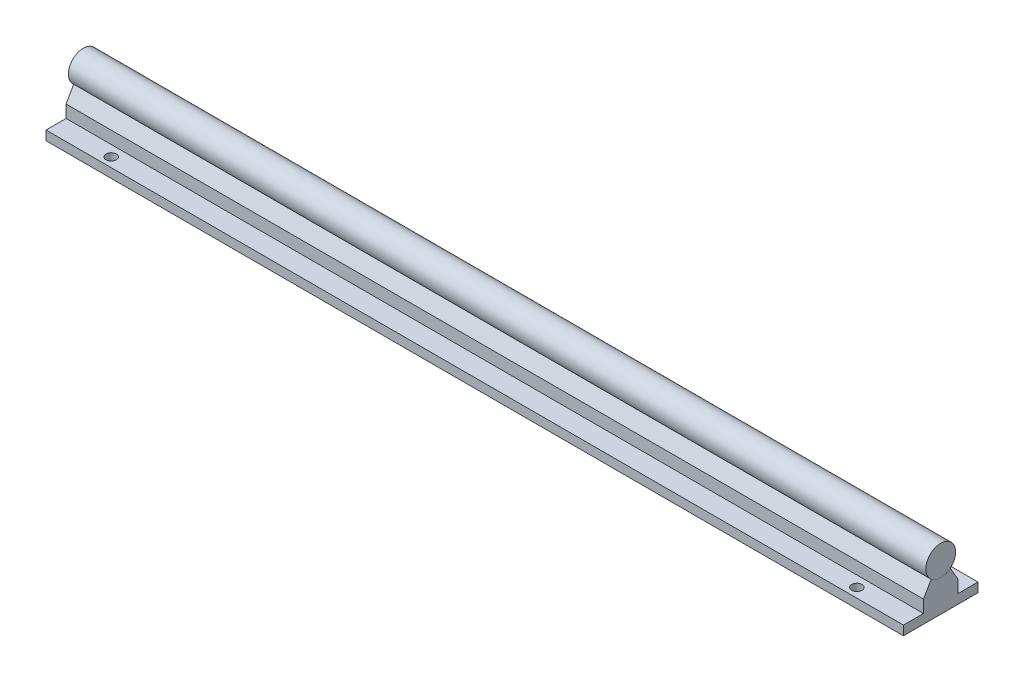
ISO-10303-21;
HEADER;
FILE_DESCRIPTION(('STEP AP214'),'2;1');
FILE_NAME('part.step','',(''),(''),'','','');
FILE_SCHEMA(('AUTOMOTIVE_DESIGN { 1 0 10303 214 1 1 1 1 }'));
ENDSEC;
DATA;
#1=APPLICATION_CONTEXT('core data for automotive mechanical design processes');
#2=APPLICATION_PROTOCOL_DEFINITION('international standard','automotive_design',2000,#1);
#3=PRODUCT_CONTEXT('',#1,'mechanical');
#4=PRODUCT('Part','Part','',(#3));
#5=PRODUCT_RELATED_PRODUCT_CATEGORY('part','',(#4));
#6=PRODUCT_DEFINITION_FORMATION('','',#4);
#7=PRODUCT_DEFINITION_CONTEXT('part definition',#1,'design');
#8=PRODUCT_DEFINITION('design','',#6,#7);
#9=PRODUCT_DEFINITION_SHAPE('','',#8);
#10=(LENGTH_UNIT() NAMED_UNIT(*) SI_UNIT(.MILLI.,.METRE.));
#11=(NAMED_UNIT(*) PLANE_ANGLE_UNIT() SI_UNIT($,.RADIAN.));
#12=(NAMED_UNIT(*) SI_UNIT($,.STERADIAN.) SOLID_ANGLE_UNIT());
#13=UNCERTAINTY_MEASURE_WITH_UNIT(LENGTH_MEASURE(1.E-05),#10,'distance_accuracy_value','');
#14=(GEOMETRIC_REPRESENTATION_CONTEXT(3) GLOBAL_UNCERTAINTY_ASSIGNED_CONTEXT((#13)) GLOBAL_UNIT_ASSIGNED_CONTEXT((#10,
#11,#12)) REPRESENTATION_CONTEXT('',''));
#15=CARTESIAN_POINT('',(0.,0.,0.));
#16=DIRECTION('',(0.,0.,1.));
#17=DIRECTION('',(1.,0.,0.));
#18=AXIS2_PLACEMENT_3D('',#15,#16,#17);
#19=CARTESIAN_POINT('',(460.,-20.,20.));
#20=DIRECTION('',(0.,0.,-1.));
#21=DIRECTION('',(-1.,0.,0.));
#22=AXIS2_PLACEMENT_3D('',#19,#20,#21);
#23=PLANE('',#22);
#24=DIRECTION('',(0.,-1.,0.));
#25=VECTOR('',#24,1.);
#26=CARTESIAN_POINT('',(0.,-20.,20.));
#27=LINE('',#26,#25);
#28=CARTESIAN_POINT('',(0.,-20.,20.));
#29=VERTEX_POINT('',#28);
#30=CARTESIAN_POINT('',(0.,-25.,20.));
#31=VERTEX_POINT('',#30);
#32=EDGE_CURVE('E155',#29,#31,#27,.T.);
#33=ORIENTED_EDGE('',*,*,#32,.T.);
#34=DIRECTION('',(-1.,0.,0.));
#35=VECTOR('',#34,1.);
#36=CARTESIAN_POINT('',(460.,-25.,20.));
#37=LINE('',#36,#35);
#38=CARTESIAN_POINT('',(460.,-25.,20.));
#39=VERTEX_POINT('',#38);
#40=EDGE_CURVE('E12',#39,#31,#37,.T.);
#41=ORIENTED_EDGE('',*,*,#40,.F.);
#42=DIRECTION('',(0.,-1.,0.));
#43=VECTOR('',#42,1.);
#44=CARTESIAN_POINT('',(460.,-20.,20.));
#45=LINE('',#44,#43);
#46=CARTESIAN_POINT('',(460.,-20.,20.));
#47=VERTEX_POINT('',#46);
#48=EDGE_CURVE('E174',#47,#39,#45,.T.);
#49=ORIENTED_EDGE('',*,*,#48,.F.);
#50=DIRECTION('',(-1.,0.,0.));
#51=VECTOR('',#50,1.);
#52=CARTESIAN_POINT('',(460.,-20.,20.));
#53=LINE('',#52,#51);
#54=EDGE_CURVE('E151',#47,#29,#53,.T.);
#55=ORIENTED_EDGE('',*,*,#54,.T.);
#56=EDGE_LOOP('',(#33,#41,#49,#55));
#57=FACE_BOUND('',#56,.T.);
#58=ADVANCED_FACE('F47',(#57),#23,.F.);
#59=CARTESIAN_POINT('',(460.,-25.,20.));
#60=DIRECTION('',(0.,1.,0.));
#61=DIRECTION('',(0.,0.,1.));
#62=AXIS2_PLACEMENT_3D('',#59,#60,#61);
#63=PLANE('',#62);
#64=CARTESIAN_POINT('',(30.,-25.,-15.));
#65=DIRECTION('',(0.,1.,0.));
#66=DIRECTION('',(0.,0.,1.));
#67=AXIS2_PLACEMENT_3D('',#64,#65,#66);
#68=CIRCLE('',#67,2.75);
#69=CARTESIAN_POINT('',(30.,-25.,-12.25));
#70=VERTEX_POINT('',#69);
#71=EDGE_CURVE('E236',#70,#70,#68,.T.);
#72=ORIENTED_EDGE('',*,*,#71,.T.);
#73=EDGE_LOOP('',(#72));
#74=FACE_BOUND('',#73,.T.);
#75=CARTESIAN_POINT('',(30.,-25.,15.));
#76=DIRECTION('',(0.,1.,0.));
#77=DIRECTION('',(0.,0.,1.));
#78=AXIS2_PLACEMENT_3D('',#75,#76,#77);
#79=CIRCLE('',#78,2.75);
#80=CARTESIAN_POINT('',(30.,-25.,17.75));
#81=VERTEX_POINT('',#80);
#82=EDGE_CURVE('E230',#81,#81,#79,.T.);
#83=ORIENTED_EDGE('',*,*,#82,.T.);
#84=EDGE_LOOP('',(#83));
#85=FACE_BOUND('',#84,.T.);
#86=CARTESIAN_POINT('',(430.,-25.,14.9999999999999));
#87=DIRECTION('',(0.,1.,0.));
#88=DIRECTION('',(0.,0.,1.));
#89=AXIS2_PLACEMENT_3D('',#86,#87,#88);
#90=CIRCLE('',#89,2.74999999999998);
#91=CARTESIAN_POINT('',(430.,-25.,17.7499999999999));
#92=VERTEX_POINT('',#91);
#93=EDGE_CURVE('E224',#92,#92,#90,.T.);
#94=ORIENTED_EDGE('',*,*,#93,.T.);
#95=EDGE_LOOP('',(#94));
#96=FACE_BOUND('',#95,.T.);
#97=CARTESIAN_POINT('',(430.,-25.,-15.0000000000001));
#98=DIRECTION('',(0.,1.,0.));
#99=DIRECTION('',(0.,0.,1.));
#100=AXIS2_PLACEMENT_3D('',#97,#98,#99);
#101=CIRCLE('',#100,2.74999999999998);
#102=CARTESIAN_POINT('',(430.,-25.,-12.2500000000001));
#103=VERTEX_POINT('',#102);
#104=EDGE_CURVE('E159',#103,#103,#101,.T.);
#105=ORIENTED_EDGE('',*,*,#104,.T.);
#106=EDGE_LOOP('',(#105));
#107=FACE_BOUND('',#106,.T.);
#108=DIRECTION('',(0.,0.,-1.));
#109=VECTOR('',#108,1.);
#110=CARTESIAN_POINT('',(0.,-25.,20.));
#111=LINE('',#110,#109);
#112=CARTESIAN_POINT('',(0.,-25.,-20.));
#113=VERTEX_POINT('',#112);
#114=EDGE_CURVE('E158',#31,#113,#111,.T.);
#115=ORIENTED_EDGE('',*,*,#114,.T.);
#116=DIRECTION('',(-1.,0.,0.));
#117=VECTOR('',#116,1.);
#118=CARTESIAN_POINT('',(460.,-25.,-20.));
#119=LINE('',#118,#117);
#120=CARTESIAN_POINT('',(460.,-25.,-20.));
#121=VERTEX_POINT('',#120);
#122=EDGE_CURVE('E55',#121,#113,#119,.T.);
#123=ORIENTED_EDGE('',*,*,#122,.F.);
#124=DIRECTION('',(0.,0.,-1.));
#125=VECTOR('',#124,1.);
#126=CARTESIAN_POINT('',(460.,-25.,20.));
#127=LINE('',#126,#125);
#128=EDGE_CURVE('E112',#39,#121,#127,.T.);
#129=ORIENTED_EDGE('',*,*,#128,.F.);
#130=ORIENTED_EDGE('',*,*,#40,.T.);
#131=EDGE_LOOP('',(#115,#123,#129,#130));
#132=FACE_BOUND('',#131,.T.);
#133=ADVANCED_FACE('F245',(#74,#85,#96,#107,#132),#63,.F.);
#134=CARTESIAN_POINT('',(460.,-20.,-20.));
#135=DIRECTION('',(0.,0.,1.));
#136=DIRECTION('',(1.,0.,0.));
#137=AXIS2_PLACEMENT_3D('',#134,#135,#136);
#138=PLANE('',#137);
#139=DIRECTION('',(0.,1.,0.));
#140=VECTOR('',#139,1.);
#141=CARTESIAN_POINT('',(0.,-20.,-20.));
#142=LINE('',#141,#140);
#143=CARTESIAN_POINT('',(0.,-20.,-20.));
#144=VERTEX_POINT('',#143);
#145=EDGE_CURVE('E161',#113,#144,#142,.T.);
#146=ORIENTED_EDGE('',*,*,#145,.T.);
#147=DIRECTION('',(-1.,0.,0.));
#148=VECTOR('',#147,1.);
#149=CARTESIAN_POINT('',(460.,-20.,-20.));
#150=LINE('',#149,#148);
#151=CARTESIAN_POINT('',(460.,-20.,-20.));
#152=VERTEX_POINT('',#151);
#153=EDGE_CURVE('E187',#152,#144,#150,.T.);
#154=ORIENTED_EDGE('',*,*,#153,.F.);
#155=DIRECTION('',(0.,1.,0.));
#156=VECTOR('',#155,1.);
#157=CARTESIAN_POINT('',(460.,-20.,-20.));
#158=LINE('',#157,#156);
#159=EDGE_CURVE('E195',#121,#152,#158,.T.);
#160=ORIENTED_EDGE('',*,*,#159,.F.);
#161=ORIENTED_EDGE('',*,*,#122,.T.);
#162=EDGE_LOOP('',(#146,#154,#160,#161));
#163=FACE_BOUND('',#162,.T.);
#164=ADVANCED_FACE('F193',(#163),#138,.F.);
#165=CARTESIAN_POINT('',(460.,-20.,-9.24999999999999));
#166=DIRECTION('',(0.,-1.,0.));
#167=DIRECTION('',(0.,0.,-1.));
#168=AXIS2_PLACEMENT_3D('',#165,#166,#167);
#169=PLANE('',#168);
#170=CARTESIAN_POINT('',(30.,-20.,-15.));
#171=DIRECTION('',(0.,1.,0.));
#172=DIRECTION('',(0.,0.,1.));
#173=AXIS2_PLACEMENT_3D('',#170,#171,#172);
#174=CIRCLE('',#173,2.75);
#175=CARTESIAN_POINT('',(30.,-20.,-12.25));
#176=VERTEX_POINT('',#175);
#177=EDGE_CURVE('E239',#176,#176,#174,.T.);
#178=ORIENTED_EDGE('',*,*,#177,.F.);
#179=EDGE_LOOP('',(#178));
#180=FACE_BOUND('',#179,.T.);
#181=CARTESIAN_POINT('',(430.,-20.,-15.0000000000001));
#182=DIRECTION('',(0.,1.,0.));
#183=DIRECTION('',(0.,0.,1.));
#184=AXIS2_PLACEMENT_3D('',#181,#182,#183);
#185=CIRCLE('',#184,2.74999999999998);
#186=CARTESIAN_POINT('',(430.,-20.,-12.2500000000001));
#187=VERTEX_POINT('',#186);
#188=EDGE_CURVE('E221',#187,#187,#185,.T.);
#189=ORIENTED_EDGE('',*,*,#188,.F.);
#190=EDGE_LOOP('',(#189));
#191=FACE_BOUND('',#190,.T.);
#192=DIRECTION('',(0.,0.,1.));
#193=VECTOR('',#192,1.);
#194=CARTESIAN_POINT('',(0.,-20.,-9.24999999999999));
#195=LINE('',#194,#193);
#196=CARTESIAN_POINT('',(0.,-20.,-9.24999999999999));
#197=VERTEX_POINT('',#196);
#198=EDGE_CURVE('E163',#144,#197,#195,.T.);
#199=ORIENTED_EDGE('',*,*,#198,.T.);
#200=DIRECTION('',(-1.,0.,0.));
#201=VECTOR('',#200,1.);
#202=CARTESIAN_POINT('',(460.,-20.,-9.24999999999999));
#203=LINE('',#202,#201);
#204=CARTESIAN_POINT('',(460.,-20.,-9.24999999999999));
#205=VERTEX_POINT('',#204);
#206=EDGE_CURVE('E184',#205,#197,#203,.T.);
#207=ORIENTED_EDGE('',*,*,#206,.F.);
#208=DIRECTION('',(0.,0.,1.));
#209=VECTOR('',#208,1.);
#210=CARTESIAN_POINT('',(460.,-20.,-9.24999999999999));
#211=LINE('',#210,#209);
#212=EDGE_CURVE('E213',#152,#205,#211,.T.);
#213=ORIENTED_EDGE('',*,*,#212,.F.);
#214=ORIENTED_EDGE('',*,*,#153,.T.);
#215=EDGE_LOOP('',(#199,#207,#213,#214));
#216=FACE_BOUND('',#215,.T.);
#217=ADVANCED_FACE('F204',(#180,#191,#216),#169,.F.);
#218=CARTESIAN_POINT('',(460.,-13.3,-9.24999999999999));
#219=DIRECTION('',(0.,0.,1.));
#220=DIRECTION('',(0.,-1.,0.));
#221=AXIS2_PLACEMENT_3D('',#218,#219,#220);
#222=PLANE('',#221);
#223=DIRECTION('',(0.,1.,0.));
#224=VECTOR('',#223,1.);
#225=CARTESIAN_POINT('',(0.,-13.3,-9.24999999999999));
#226=LINE('',#225,#224);
#227=CARTESIAN_POINT('',(0.,-13.3,-9.24999999999999));
#228=VERTEX_POINT('',#227);
#229=EDGE_CURVE('E165',#197,#228,#226,.T.);
#230=ORIENTED_EDGE('',*,*,#229,.T.);
#231=DIRECTION('',(-1.,0.,0.));
#232=VECTOR('',#231,1.);
#233=CARTESIAN_POINT('',(460.,-13.3,-9.24999999999999));
#234=LINE('',#233,#232);
#235=CARTESIAN_POINT('',(460.,-13.3,-9.24999999999999));
#236=VERTEX_POINT('',#235);
#237=EDGE_CURVE('E181',#236,#228,#234,.T.);
#238=ORIENTED_EDGE('',*,*,#237,.F.);
#239=DIRECTION('',(0.,1.,0.));
#240=VECTOR('',#239,1.);
#241=CARTESIAN_POINT('',(460.,-13.3,-9.24999999999999));
#242=LINE('',#241,#240);
#243=EDGE_CURVE('E210',#205,#236,#242,.T.);
#244=ORIENTED_EDGE('',*,*,#243,.F.);
#245=ORIENTED_EDGE('',*,*,#206,.T.);
#246=EDGE_LOOP('',(#230,#238,#244,#245));
#247=FACE_BOUND('',#246,.T.);
#248=ADVANCED_FACE('F208',(#247),#222,.F.);
#249=CARTESIAN_POINT('',(460.,-13.3,-9.24999999999999));
#250=DIRECTION('',(0.,-0.5,0.866025403784439));
#251=DIRECTION('',(0.,-0.866025403784439,-0.5));
#252=AXIS2_PLACEMENT_3D('',#249,#250,#251);
#253=PLANE('',#252);
#254=DIRECTION('',(0.,0.866025403784438,0.5));
#255=VECTOR('',#254,1.);
#256=CARTESIAN_POINT('',(0.,-13.3,-9.24999999999999));
#257=LINE('',#256,#255);
#258=CARTESIAN_POINT('',(0.,-6.146879406902,-5.120143900029));
#259=VERTEX_POINT('',#258);
#260=EDGE_CURVE('E167',#228,#259,#257,.T.);
#261=ORIENTED_EDGE('',*,*,#260,.T.);
#262=DIRECTION('',(-1.,0.,0.));
#263=VECTOR('',#262,1.);
#264=CARTESIAN_POINT('',(460.,-6.146879406902,-5.120143900029));
#265=LINE('',#264,#263);
#266=CARTESIAN_POINT('',(460.,-6.146879406902,-5.120143900029));
#267=VERTEX_POINT('',#266);
#268=EDGE_CURVE('E178',#267,#259,#265,.T.);
#269=ORIENTED_EDGE('',*,*,#268,.F.);
#270=DIRECTION('',(0.,0.866025403784438,0.5));
#271=VECTOR('',#270,1.);
#272=CARTESIAN_POINT('',(460.,-13.3,-9.24999999999999));
#273=LINE('',#272,#271);
#274=EDGE_CURVE('E212',#236,#267,#273,.T.);
#275=ORIENTED_EDGE('',*,*,#274,.F.);
#276=ORIENTED_EDGE('',*,*,#237,.T.);
#277=EDGE_LOOP('',(#261,#269,#275,#276));
#278=FACE_BOUND('',#277,.T.);
#279=ADVANCED_FACE('F286',(#278),#253,.F.);
#280=CARTESIAN_POINT('',(460.,0.,0.));
#281=DIRECTION('',(-1.,0.,0.));
#282=DIRECTION('',(0.,0.,1.));
#283=AXIS2_PLACEMENT_3D('',#280,#281,#282);
#284=CYLINDRICAL_SURFACE('',#283,8.);
#285=CARTESIAN_POINT('',(0.,0.,0.));
#286=DIRECTION('',(-1.,0.,0.));
#287=DIRECTION('',(0.,0.,-1.));
#288=AXIS2_PLACEMENT_3D('',#285,#286,#287);
#289=CIRCLE('',#288,8.);
#290=CARTESIAN_POINT('',(0.,-6.14687940690199,5.12014390002901));
#291=VERTEX_POINT('',#290);
#292=EDGE_CURVE('E169',#259,#291,#289,.T.);
#293=ORIENTED_EDGE('',*,*,#292,.T.);
#294=DIRECTION('',(-1.,0.,0.));
#295=VECTOR('',#294,1.);
#296=CARTESIAN_POINT('',(460.,-6.14687940690199,5.12014390002901));
#297=LINE('',#296,#295);
#298=CARTESIAN_POINT('',(460.,-6.14687940690199,5.12014390002901));
#299=VERTEX_POINT('',#298);
#300=EDGE_CURVE('E146',#299,#291,#297,.T.);
#301=ORIENTED_EDGE('',*,*,#300,.F.);
#302=CARTESIAN_POINT('',(460.,0.,0.));
#303=DIRECTION('',(-1.,0.,0.));
#304=DIRECTION('',(0.,0.,-1.));
#305=AXIS2_PLACEMENT_3D('',#302,#303,#304);
#306=CIRCLE('',#305,8.);
#307=EDGE_CURVE('E137',#267,#299,#306,.T.);
#308=ORIENTED_EDGE('',*,*,#307,.F.);
#309=ORIENTED_EDGE('',*,*,#268,.T.);
#310=EDGE_LOOP('',(#293,#301,#308,#309));
#311=FACE_BOUND('',#310,.T.);
#312=ADVANCED_FACE('F283',(#311),#284,.F.);
#313=CARTESIAN_POINT('',(460.,-6.14687940690199,5.12014390002901));
#314=DIRECTION('',(0.,-0.500000000000001,-0.866025403784438));
#315=DIRECTION('',(0.,0.866025403784438,-0.500000000000001));
#316=AXIS2_PLACEMENT_3D('',#313,#314,#315);
#317=PLANE('',#316);
#318=DIRECTION('',(0.,-0.866025403784438,0.500000000000001));
#319=VECTOR('',#318,1.);
#320=CARTESIAN_POINT('',(0.,-6.14687940690199,5.12014390002901));
#321=LINE('',#320,#319);
#322=CARTESIAN_POINT('',(0.,-13.3,9.25000000000001));
#323=VERTEX_POINT('',#322);
#324=EDGE_CURVE('E145',#291,#323,#321,.T.);
#325=ORIENTED_EDGE('',*,*,#324,.T.);
#326=DIRECTION('',(-1.,0.,0.));
#327=VECTOR('',#326,1.);
#328=CARTESIAN_POINT('',(460.,-13.3,9.25000000000001));
#329=LINE('',#328,#327);
#330=CARTESIAN_POINT('',(460.,-13.3,9.25000000000001));
#331=VERTEX_POINT('',#330);
#332=EDGE_CURVE('E142',#331,#323,#329,.T.);
#333=ORIENTED_EDGE('',*,*,#332,.F.);
#334=DIRECTION('',(0.,-0.866025403784438,0.500000000000001));
#335=VECTOR('',#334,1.);
#336=CARTESIAN_POINT('',(460.,-6.14687940690199,5.12014390002901));
#337=LINE('',#336,#335);
#338=EDGE_CURVE('E131',#299,#331,#337,.T.);
#339=ORIENTED_EDGE('',*,*,#338,.F.);
#340=ORIENTED_EDGE('',*,*,#300,.T.);
#341=EDGE_LOOP('',(#325,#333,#339,#340));
#342=FACE_BOUND('',#341,.T.);
#343=ADVANCED_FACE('F143',(#342),#317,.F.);
#344=CARTESIAN_POINT('',(460.,-20.,9.25000000000001));
#345=DIRECTION('',(0.,0.,-1.));
#346=DIRECTION('',(0.,1.,0.));
#347=AXIS2_PLACEMENT_3D('',#344,#345,#346);
#348=PLANE('',#347);
#349=DIRECTION('',(0.,-1.,0.));
#350=VECTOR('',#349,1.);
#351=CARTESIAN_POINT('',(0.,-20.,9.25000000000001));
#352=LINE('',#351,#350);
#353=CARTESIAN_POINT('',(0.,-20.,9.25000000000001));
#354=VERTEX_POINT('',#353);
#355=EDGE_CURVE('E98',#323,#354,#352,.T.);
#356=ORIENTED_EDGE('',*,*,#355,.T.);
#357=DIRECTION('',(-1.,0.,0.));
#358=VECTOR('',#357,1.);
#359=CARTESIAN_POINT('',(460.,-20.,9.25000000000001));
#360=LINE('',#359,#358);
#361=CARTESIAN_POINT('',(460.,-20.,9.25000000000001));
#362=VERTEX_POINT('',#361);
#363=EDGE_CURVE('E147',#362,#354,#360,.T.);
#364=ORIENTED_EDGE('',*,*,#363,.F.);
#365=DIRECTION('',(0.,-1.,0.));
#366=VECTOR('',#365,1.);
#367=CARTESIAN_POINT('',(460.,-20.,9.25000000000001));
#368=LINE('',#367,#366);
#369=EDGE_CURVE('E135',#331,#362,#368,.T.);
#370=ORIENTED_EDGE('',*,*,#369,.F.);
#371=ORIENTED_EDGE('',*,*,#332,.T.);
#372=EDGE_LOOP('',(#356,#364,#370,#371));
#373=FACE_BOUND('',#372,.T.);
#374=ADVANCED_FACE('F149',(#373),#348,.F.);
#375=CARTESIAN_POINT('',(460.,-20.,20.));
#376=DIRECTION('',(0.,-1.,0.));
#377=DIRECTION('',(0.,0.,-1.));
#378=AXIS2_PLACEMENT_3D('',#375,#376,#377);
#379=PLANE('',#378);
#380=CARTESIAN_POINT('',(30.,-20.,15.));
#381=DIRECTION('',(0.,1.,0.));
#382=DIRECTION('',(0.,0.,1.));
#383=AXIS2_PLACEMENT_3D('',#380,#381,#382);
#384=CIRCLE('',#383,2.75);
#385=CARTESIAN_POINT('',(30.,-20.,17.75));
#386=VERTEX_POINT('',#385);
#387=EDGE_CURVE('E233',#386,#386,#384,.T.);
#388=ORIENTED_EDGE('',*,*,#387,.F.);
#389=EDGE_LOOP('',(#388));
#390=FACE_BOUND('',#389,.T.);
#391=CARTESIAN_POINT('',(430.,-20.,14.9999999999999));
#392=DIRECTION('',(0.,1.,0.));
#393=DIRECTION('',(0.,0.,1.));
#394=AXIS2_PLACEMENT_3D('',#391,#392,#393);
#395=CIRCLE('',#394,2.74999999999998);
#396=CARTESIAN_POINT('',(430.,-20.,17.7499999999999));
#397=VERTEX_POINT('',#396);
#398=EDGE_CURVE('E227',#397,#397,#395,.T.);
#399=ORIENTED_EDGE('',*,*,#398,.F.);
#400=EDGE_LOOP('',(#399));
#401=FACE_BOUND('',#400,.T.);
#402=DIRECTION('',(0.,0.,1.));
#403=VECTOR('',#402,1.);
#404=CARTESIAN_POINT('',(0.,-20.,20.));
#405=LINE('',#404,#403);
#406=EDGE_CURVE('E104',#354,#29,#405,.T.);
#407=ORIENTED_EDGE('',*,*,#406,.T.);
#408=ORIENTED_EDGE('',*,*,#54,.F.);
#409=DIRECTION('',(0.,0.,1.));
#410=VECTOR('',#409,1.);
#411=CARTESIAN_POINT('',(460.,-20.,20.));
#412=LINE('',#411,#410);
#413=EDGE_CURVE('E63',#362,#47,#412,.T.);
#414=ORIENTED_EDGE('',*,*,#413,.F.);
#415=ORIENTED_EDGE('',*,*,#363,.T.);
#416=EDGE_LOOP('',(#407,#408,#414,#415));
#417=FACE_BOUND('',#416,.T.);
#418=ADVANCED_FACE('F338',(#390,#401,#417),#379,.F.);
#419=CARTESIAN_POINT('',(460.,0.,0.));
#420=DIRECTION('',(1.,0.,0.));
#421=DIRECTION('',(0.,0.,-1.));
#422=AXIS2_PLACEMENT_3D('',#419,#420,#421);
#423=PLANE('',#422);
#424=ORIENTED_EDGE('',*,*,#48,.T.);
#425=ORIENTED_EDGE('',*,*,#128,.T.);
#426=ORIENTED_EDGE('',*,*,#159,.T.);
#427=ORIENTED_EDGE('',*,*,#212,.T.);
#428=ORIENTED_EDGE('',*,*,#243,.T.);
#429=ORIENTED_EDGE('',*,*,#274,.T.);
#430=ORIENTED_EDGE('',*,*,#307,.T.);
#431=ORIENTED_EDGE('',*,*,#338,.T.);
#432=ORIENTED_EDGE('',*,*,#369,.T.);
#433=ORIENTED_EDGE('',*,*,#413,.T.);
#434=EDGE_LOOP('',(#424,#425,#426,#427,#428,#429,#430,#431,#432,#433));
#435=FACE_BOUND('',#434,.T.);
#436=ADVANCED_FACE('F133',(#435),#423,.T.);
#437=CARTESIAN_POINT('',(0.,0.,0.));
#438=DIRECTION('',(1.,0.,0.));
#439=DIRECTION('',(0.,0.,-1.));
#440=AXIS2_PLACEMENT_3D('',#437,#438,#439);
#441=PLANE('',#440);
#442=ORIENTED_EDGE('',*,*,#32,.F.);
#443=ORIENTED_EDGE('',*,*,#406,.F.);
#444=ORIENTED_EDGE('',*,*,#355,.F.);
#445=ORIENTED_EDGE('',*,*,#324,.F.);
#446=ORIENTED_EDGE('',*,*,#292,.F.);
#447=ORIENTED_EDGE('',*,*,#260,.F.);
#448=ORIENTED_EDGE('',*,*,#229,.F.);
#449=ORIENTED_EDGE('',*,*,#198,.F.);
#450=ORIENTED_EDGE('',*,*,#145,.F.);
#451=ORIENTED_EDGE('',*,*,#114,.F.);
#452=EDGE_LOOP('',(#442,#443,#444,#445,#446,#447,#448,#449,#450,#451));
#453=FACE_BOUND('',#452,.T.);
#454=ADVANCED_FACE('F199',(#453),#441,.F.);
#455=CARTESIAN_POINT('',(430.,-25.,-15.0000000000001));
#456=DIRECTION('',(0.,1.,0.));
#457=DIRECTION('',(0.,0.,1.));
#458=AXIS2_PLACEMENT_3D('',#455,#456,#457);
#459=CYLINDRICAL_SURFACE('',#458,2.74999999999998);
#460=ORIENTED_EDGE('',*,*,#104,.F.);
#461=EDGE_LOOP('',(#460));
#462=FACE_BOUND('',#461,.T.);
#463=ORIENTED_EDGE('',*,*,#188,.T.);
#464=EDGE_LOOP('',(#463));
#465=FACE_BOUND('',#464,.T.);
#466=ADVANCED_FACE('F260',(#462,#465),#459,.F.);
#467=CARTESIAN_POINT('',(430.,-25.,14.9999999999999));
#468=DIRECTION('',(0.,1.,0.));
#469=DIRECTION('',(0.,0.,1.));
#470=AXIS2_PLACEMENT_3D('',#467,#468,#469);
#471=CYLINDRICAL_SURFACE('',#470,2.74999999999998);
#472=ORIENTED_EDGE('',*,*,#93,.F.);
#473=EDGE_LOOP('',(#472));
#474=FACE_BOUND('',#473,.T.);
#475=ORIENTED_EDGE('',*,*,#398,.T.);
#476=EDGE_LOOP('',(#475));
#477=FACE_BOUND('',#476,.T.);
#478=ADVANCED_FACE('F262',(#474,#477),#471,.F.);
#479=CARTESIAN_POINT('',(30.,-25.,15.));
#480=DIRECTION('',(0.,1.,0.));
#481=DIRECTION('',(0.,0.,1.));
#482=AXIS2_PLACEMENT_3D('',#479,#480,#481);
#483=CYLINDRICAL_SURFACE('',#482,2.75);
#484=ORIENTED_EDGE('',*,*,#82,.F.);
#485=EDGE_LOOP('',(#484));
#486=FACE_BOUND('',#485,.T.);
#487=ORIENTED_EDGE('',*,*,#387,.T.);
#488=EDGE_LOOP('',(#487));
#489=FACE_BOUND('',#488,.T.);
#490=ADVANCED_FACE('F251',(#486,#489),#483,.F.);
#491=CARTESIAN_POINT('',(30.,-25.,-15.));
#492=DIRECTION('',(0.,1.,0.));
#493=DIRECTION('',(0.,0.,1.));
#494=AXIS2_PLACEMENT_3D('',#491,#492,#493);
#495=CYLINDRICAL_SURFACE('',#494,2.75);
#496=ORIENTED_EDGE('',*,*,#71,.F.);
#497=EDGE_LOOP('',(#496));
#498=FACE_BOUND('',#497,.T.);
#499=ORIENTED_EDGE('',*,*,#177,.T.);
#500=EDGE_LOOP('',(#499));
#501=FACE_BOUND('',#500,.T.);
#502=ADVANCED_FACE('F248',(#498,#501),#495,.F.);
#503=CLOSED_SHELL('',(#58,#133,#164,#217,#248,#279,#312,#343,#374,#418,#436,#454,#466,#478,#490,#502));
#504=MANIFOLD_SOLID_BREP('B2',#503);
#505=CARTESIAN_POINT('',(460.,0.,0.));
#506=DIRECTION('',(-1.,0.,0.));
#507=DIRECTION('',(0.,0.,1.));
#508=AXIS2_PLACEMENT_3D('',#505,#506,#507);
#509=CYLINDRICAL_SURFACE('',#508,8.);
#510=CARTESIAN_POINT('',(460.,0.,0.));
#511=DIRECTION('',(1.,0.,0.));
#512=DIRECTION('',(0.,0.,-1.));
#513=AXIS2_PLACEMENT_3D('',#510,#511,#512);
#514=CIRCLE('',#513,8.);
#515=CARTESIAN_POINT('',(460.,0.,-8.));
#516=VERTEX_POINT('',#515);
#517=EDGE_CURVE('E46',#516,#516,#514,.T.);
#518=ORIENTED_EDGE('',*,*,#517,.F.);
#519=EDGE_LOOP('',(#518));
#520=FACE_BOUND('',#519,.T.);
#521=CARTESIAN_POINT('',(0.,0.,0.));
#522=DIRECTION('',(1.,0.,0.));
#523=DIRECTION('',(0.,0.,-1.));
#524=AXIS2_PLACEMENT_3D('',#521,#522,#523);
#525=CIRCLE('',#524,8.);
#526=CARTESIAN_POINT('',(0.,0.,-8.));
#527=VERTEX_POINT('',#526);
#528=EDGE_CURVE('E416',#527,#527,#525,.T.);
#529=ORIENTED_EDGE('',*,*,#528,.T.);
#530=EDGE_LOOP('',(#529));
#531=FACE_BOUND('',#530,.T.);
#532=ADVANCED_FACE('F413',(#520,#531),#509,.T.);
#533=CARTESIAN_POINT('',(460.,0.,0.));
#534=DIRECTION('',(1.,0.,0.));
#535=DIRECTION('',(0.,0.,-1.));
#536=AXIS2_PLACEMENT_3D('',#533,#534,#535);
#537=PLANE('',#536);
#538=ORIENTED_EDGE('',*,*,#517,.T.);
#539=EDGE_LOOP('',(#538));
#540=FACE_BOUND('',#539,.T.);
#541=ADVANCED_FACE('F428',(#540),#537,.T.);
#542=CARTESIAN_POINT('',(0.,0.,0.));
#543=DIRECTION('',(1.,0.,0.));
#544=DIRECTION('',(0.,0.,-1.));
#545=AXIS2_PLACEMENT_3D('',#542,#543,#544);
#546=PLANE('',#545);
#547=ORIENTED_EDGE('',*,*,#528,.F.);
#548=EDGE_LOOP('',(#547));
#549=FACE_BOUND('',#548,.T.);
#550=ADVANCED_FACE('F426',(#549),#546,.F.);
#551=CLOSED_SHELL('',(#532,#541,#550));
#552=MANIFOLD_SOLID_BREP('B6',#551);
#553=ADVANCED_BREP_SHAPE_REPRESENTATION('',(#18,#504,#552),#14);
#554=SHAPE_DEFINITION_REPRESENTATION(#9,#553);
ENDSEC;
END-ISO-10303-21;
